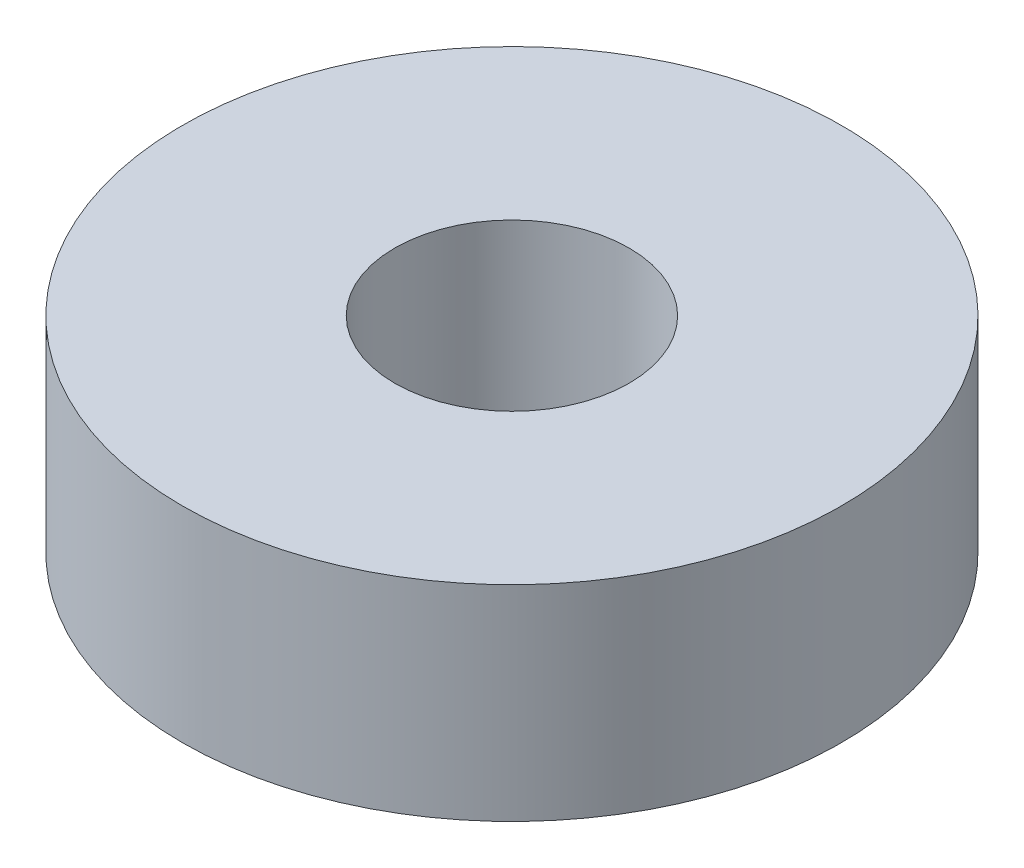
ISO-10303-21;
HEADER;
FILE_DESCRIPTION(('STEP AP214'),'2;1');
FILE_NAME('part.step','',(''),(''),'','','');
FILE_SCHEMA(('AUTOMOTIVE_DESIGN { 1 0 10303 214 1 1 1 1 }'));
ENDSEC;
DATA;
#1=APPLICATION_CONTEXT('core data for automotive mechanical design processes');
#2=APPLICATION_PROTOCOL_DEFINITION('international standard','automotive_design',2000,#1);
#3=PRODUCT_CONTEXT('',#1,'mechanical');
#4=PRODUCT('Part','Part','',(#3));
#5=PRODUCT_RELATED_PRODUCT_CATEGORY('part','',(#4));
#6=PRODUCT_DEFINITION_FORMATION('','',#4);
#7=PRODUCT_DEFINITION_CONTEXT('part definition',#1,'design');
#8=PRODUCT_DEFINITION('design','',#6,#7);
#9=PRODUCT_DEFINITION_SHAPE('','',#8);
#10=(LENGTH_UNIT() NAMED_UNIT(*) SI_UNIT(.MILLI.,.METRE.));
#11=(NAMED_UNIT(*) PLANE_ANGLE_UNIT() SI_UNIT($,.RADIAN.));
#12=(NAMED_UNIT(*) SI_UNIT($,.STERADIAN.) SOLID_ANGLE_UNIT());
#13=UNCERTAINTY_MEASURE_WITH_UNIT(LENGTH_MEASURE(1.E-05),#10,'distance_accuracy_value','');
#14=(GEOMETRIC_REPRESENTATION_CONTEXT(3) GLOBAL_UNCERTAINTY_ASSIGNED_CONTEXT((#13)) GLOBAL_UNIT_ASSIGNED_CONTEXT((#10,
#11,#12)) REPRESENTATION_CONTEXT('',''));
#15=CARTESIAN_POINT('',(0.,0.,0.));
#16=DIRECTION('',(0.,0.,1.));
#17=DIRECTION('',(1.,0.,0.));
#18=AXIS2_PLACEMENT_3D('',#15,#16,#17);
#19=CARTESIAN_POINT('',(0.,7.,0.));
#20=DIRECTION('',(0.,-1.,0.));
#21=DIRECTION('',(0.,0.,-1.));
#22=AXIS2_PLACEMENT_3D('',#19,#20,#21);
#23=CYLINDRICAL_SURFACE('',#22,11.25);
#24=CARTESIAN_POINT('',(0.,7.,0.));
#25=DIRECTION('',(0.,1.,0.));
#26=DIRECTION('',(0.,0.,1.));
#27=AXIS2_PLACEMENT_3D('',#24,#25,#26);
#28=CIRCLE('',#27,11.25);
#29=CARTESIAN_POINT('',(0.,7.,11.25));
#30=VERTEX_POINT('',#29);
#31=EDGE_CURVE('E10',#30,#30,#28,.T.);
#32=ORIENTED_EDGE('',*,*,#31,.F.);
#33=EDGE_LOOP('',(#32));
#34=FACE_BOUND('',#33,.T.);
#35=CARTESIAN_POINT('',(0.,0.,0.));
#36=DIRECTION('',(0.,1.,0.));
#37=DIRECTION('',(0.,0.,1.));
#38=AXIS2_PLACEMENT_3D('',#35,#36,#37);
#39=CIRCLE('',#38,11.25);
#40=CARTESIAN_POINT('',(0.,0.,11.25));
#41=VERTEX_POINT('',#40);
#42=EDGE_CURVE('E46',#41,#41,#39,.T.);
#43=ORIENTED_EDGE('',*,*,#42,.T.);
#44=EDGE_LOOP('',(#43));
#45=FACE_BOUND('',#44,.T.);
#46=ADVANCED_FACE('F43',(#34,#45),#23,.T.);
#47=CARTESIAN_POINT('',(0.,7.,0.));
#48=DIRECTION('',(0.,1.,0.));
#49=DIRECTION('',(0.,0.,1.));
#50=AXIS2_PLACEMENT_3D('',#47,#48,#49);
#51=PLANE('',#50);
#52=CARTESIAN_POINT('',(0.,7.,0.));
#53=DIRECTION('',(0.,1.,0.));
#54=DIRECTION('',(0.,0.,1.));
#55=AXIS2_PLACEMENT_3D('',#52,#53,#54);
#56=CIRCLE('',#55,4.);
#57=CARTESIAN_POINT('',(0.,7.,4.));
#58=VERTEX_POINT('',#57);
#59=EDGE_CURVE('E57',#58,#58,#56,.T.);
#60=ORIENTED_EDGE('',*,*,#59,.F.);
#61=EDGE_LOOP('',(#60));
#62=FACE_BOUND('',#61,.T.);
#63=ORIENTED_EDGE('',*,*,#31,.T.);
#64=EDGE_LOOP('',(#63));
#65=FACE_BOUND('',#64,.T.);
#66=ADVANCED_FACE('F74',(#62,#65),#51,.T.);
#67=CARTESIAN_POINT('',(0.,0.,0.));
#68=DIRECTION('',(0.,1.,0.));
#69=DIRECTION('',(0.,0.,1.));
#70=AXIS2_PLACEMENT_3D('',#67,#68,#69);
#71=PLANE('',#70);
#72=CARTESIAN_POINT('',(0.,0.,0.));
#73=DIRECTION('',(0.,1.,0.));
#74=DIRECTION('',(0.,0.,1.));
#75=AXIS2_PLACEMENT_3D('',#72,#73,#74);
#76=CIRCLE('',#75,4.);
#77=CARTESIAN_POINT('',(0.,0.,4.));
#78=VERTEX_POINT('',#77);
#79=EDGE_CURVE('E55',#78,#78,#76,.T.);
#80=ORIENTED_EDGE('',*,*,#79,.T.);
#81=EDGE_LOOP('',(#80));
#82=FACE_BOUND('',#81,.T.);
#83=ORIENTED_EDGE('',*,*,#42,.F.);
#84=EDGE_LOOP('',(#83));
#85=FACE_BOUND('',#84,.T.);
#86=ADVANCED_FACE('F65',(#82,#85),#71,.F.);
#87=CARTESIAN_POINT('',(0.,0.,0.));
#88=DIRECTION('',(0.,1.,0.));
#89=DIRECTION('',(0.,0.,1.));
#90=AXIS2_PLACEMENT_3D('',#87,#88,#89);
#91=CYLINDRICAL_SURFACE('',#90,4.);
#92=ORIENTED_EDGE('',*,*,#79,.F.);
#93=EDGE_LOOP('',(#92));
#94=FACE_BOUND('',#93,.T.);
#95=ORIENTED_EDGE('',*,*,#59,.T.);
#96=EDGE_LOOP('',(#95));
#97=FACE_BOUND('',#96,.T.);
#98=ADVANCED_FACE('F68',(#94,#97),#91,.F.);
#99=CLOSED_SHELL('',(#46,#66,#86,#98));
#100=MANIFOLD_SOLID_BREP('B2',#99);
#101=ADVANCED_BREP_SHAPE_REPRESENTATION('',(#18,#100),#14);
#102=SHAPE_DEFINITION_REPRESENTATION(#9,#101);
ENDSEC;
END-ISO-10303-21;
